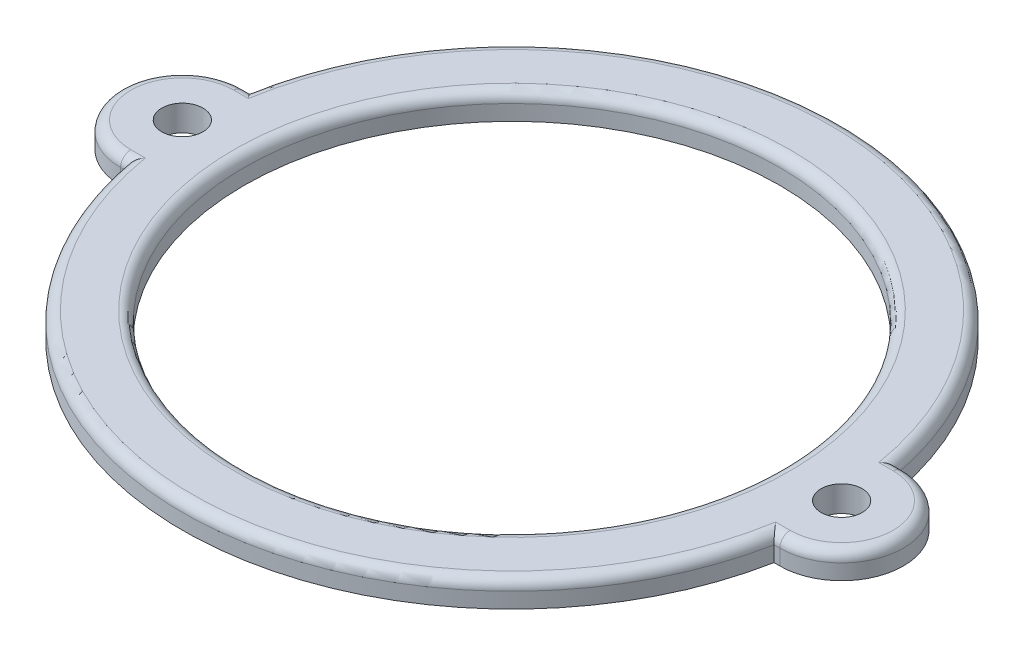
ISO-10303-21;
HEADER;
FILE_DESCRIPTION(('STEP AP214'),'2;1');
FILE_NAME('part.step','',(''),(''),'','','');
FILE_SCHEMA(('AUTOMOTIVE_DESIGN { 1 0 10303 214 1 1 1 1 }'));
ENDSEC;
DATA;
#1=APPLICATION_CONTEXT('core data for automotive mechanical design processes');
#2=APPLICATION_PROTOCOL_DEFINITION('international standard','automotive_design',2000,#1);
#3=PRODUCT_CONTEXT('',#1,'mechanical');
#4=PRODUCT('Part','Part','',(#3));
#5=PRODUCT_RELATED_PRODUCT_CATEGORY('part','',(#4));
#6=PRODUCT_DEFINITION_FORMATION('','',#4);
#7=PRODUCT_DEFINITION_CONTEXT('part definition',#1,'design');
#8=PRODUCT_DEFINITION('design','',#6,#7);
#9=PRODUCT_DEFINITION_SHAPE('','',#8);
#10=(LENGTH_UNIT() NAMED_UNIT(*) SI_UNIT(.MILLI.,.METRE.));
#11=(NAMED_UNIT(*) PLANE_ANGLE_UNIT() SI_UNIT($,.RADIAN.));
#12=(NAMED_UNIT(*) SI_UNIT($,.STERADIAN.) SOLID_ANGLE_UNIT());
#13=UNCERTAINTY_MEASURE_WITH_UNIT(LENGTH_MEASURE(1.E-05),#10,'distance_accuracy_value','');
#14=(GEOMETRIC_REPRESENTATION_CONTEXT(3) GLOBAL_UNCERTAINTY_ASSIGNED_CONTEXT((#13)) GLOBAL_UNIT_ASSIGNED_CONTEXT((#10,
#11,#12)) REPRESENTATION_CONTEXT('',''));
#15=CARTESIAN_POINT('',(0.,0.,0.));
#16=DIRECTION('',(0.,0.,1.));
#17=DIRECTION('',(1.,0.,0.));
#18=AXIS2_PLACEMENT_3D('',#15,#16,#17);
#19=CARTESIAN_POINT('',(32.,2.5,0.));
#20=DIRECTION('',(0.,-1.,0.));
#21=DIRECTION('',(0.,0.,-1.));
#22=AXIS2_PLACEMENT_3D('',#19,#20,#21);
#23=PLANE('',#22);
#24=DIRECTION('',(-1.,0.,0.));
#25=VECTOR('',#24,1.);
#26=CARTESIAN_POINT('',(32.,2.5,-5.00000000000001));
#27=LINE('',#26,#25);
#28=CARTESIAN_POINT('',(32.,2.5,-5.00000000000002));
#29=VERTEX_POINT('',#28);
#30=CARTESIAN_POINT('',(30.5941170815567,2.5,-5.00000000000001));
#31=VERTEX_POINT('',#30);
#32=EDGE_CURVE('E204',#29,#31,#27,.T.);
#33=ORIENTED_EDGE('',*,*,#32,.T.);
#34=CARTESIAN_POINT('',(0.,2.5,0.));
#35=DIRECTION('',(0.,-1.,0.));
#36=DIRECTION('',(0.,0.,-1.));
#37=AXIS2_PLACEMENT_3D('',#34,#35,#36);
#38=CIRCLE('',#37,31.);
#39=CARTESIAN_POINT('',(-30.5941170815567,2.5,-5.));
#40=VERTEX_POINT('',#39);
#41=EDGE_CURVE('E206',#31,#40,#38,.F.);
#42=ORIENTED_EDGE('',*,*,#41,.T.);
#43=DIRECTION('',(-1.,0.,0.));
#44=VECTOR('',#43,1.);
#45=CARTESIAN_POINT('',(32.,2.5,-5.));
#46=LINE('',#45,#44);
#47=CARTESIAN_POINT('',(-32.,2.5,-5.));
#48=VERTEX_POINT('',#47);
#49=EDGE_CURVE('E202',#40,#48,#46,.T.);
#50=ORIENTED_EDGE('',*,*,#49,.T.);
#51=CARTESIAN_POINT('',(-32.,2.5,0.));
#52=DIRECTION('',(0.,-1.,0.));
#53=DIRECTION('',(0.,0.,-1.));
#54=AXIS2_PLACEMENT_3D('',#51,#52,#53);
#55=CIRCLE('',#54,5.);
#56=CARTESIAN_POINT('',(-32.,2.5,5.));
#57=VERTEX_POINT('',#56);
#58=EDGE_CURVE('E198',#48,#57,#55,.F.);
#59=ORIENTED_EDGE('',*,*,#58,.T.);
#60=DIRECTION('',(1.,0.,0.));
#61=VECTOR('',#60,1.);
#62=CARTESIAN_POINT('',(32.,2.5,5.));
#63=LINE('',#62,#61);
#64=CARTESIAN_POINT('',(-30.5941170815567,2.5,5.));
#65=VERTEX_POINT('',#64);
#66=EDGE_CURVE('E193',#57,#65,#63,.T.);
#67=ORIENTED_EDGE('',*,*,#66,.T.);
#68=CARTESIAN_POINT('',(0.,2.5,0.));
#69=DIRECTION('',(0.,-1.,0.));
#70=DIRECTION('',(0.,0.,-1.));
#71=AXIS2_PLACEMENT_3D('',#68,#69,#70);
#72=CIRCLE('',#71,31.);
#73=CARTESIAN_POINT('',(30.5941170815567,2.5,5.00000000000001));
#74=VERTEX_POINT('',#73);
#75=EDGE_CURVE('E191',#65,#74,#72,.F.);
#76=ORIENTED_EDGE('',*,*,#75,.T.);
#77=DIRECTION('',(1.,0.,0.));
#78=VECTOR('',#77,1.);
#79=CARTESIAN_POINT('',(32.,2.5,5.00000000000001));
#80=LINE('',#79,#78);
#81=CARTESIAN_POINT('',(32.,2.5,5.00000000000001));
#82=VERTEX_POINT('',#81);
#83=EDGE_CURVE('E195',#74,#82,#80,.T.);
#84=ORIENTED_EDGE('',*,*,#83,.T.);
#85=CARTESIAN_POINT('',(32.,2.5,0.));
#86=DIRECTION('',(0.,-1.,0.));
#87=DIRECTION('',(0.,0.,-1.));
#88=AXIS2_PLACEMENT_3D('',#85,#86,#87);
#89=CIRCLE('',#88,5.00000000000001);
#90=EDGE_CURVE('E200',#82,#29,#89,.F.);
#91=ORIENTED_EDGE('',*,*,#90,.T.);
#92=EDGE_LOOP('',(#33,#42,#50,#59,#67,#76,#84,#91));
#93=FACE_BOUND('',#92,.T.);
#94=CARTESIAN_POINT('',(0.,2.5,0.));
#95=DIRECTION('',(0.,-1.,0.));
#96=DIRECTION('',(0.,0.,-1.));
#97=AXIS2_PLACEMENT_3D('',#94,#95,#96);
#98=CIRCLE('',#97,27.);
#99=CARTESIAN_POINT('',(0.,2.5,-27.));
#100=VERTEX_POINT('',#99);
#101=EDGE_CURVE('E138',#100,#100,#98,.T.);
#102=ORIENTED_EDGE('',*,*,#101,.T.);
#103=EDGE_LOOP('',(#102));
#104=FACE_BOUND('',#103,.T.);
#105=CARTESIAN_POINT('',(-32.,2.5,0.));
#106=DIRECTION('',(0.,1.,0.));
#107=DIRECTION('',(0.,0.,1.));
#108=AXIS2_PLACEMENT_3D('',#105,#106,#107);
#109=CIRCLE('',#108,2.);
#110=CARTESIAN_POINT('',(-32.,2.5,2.));
#111=VERTEX_POINT('',#110);
#112=EDGE_CURVE('E158',#111,#111,#109,.T.);
#113=ORIENTED_EDGE('',*,*,#112,.F.);
#114=EDGE_LOOP('',(#113));
#115=FACE_BOUND('',#114,.T.);
#116=CARTESIAN_POINT('',(32.,2.5,0.));
#117=DIRECTION('',(0.,1.,0.));
#118=DIRECTION('',(0.,0.,1.));
#119=AXIS2_PLACEMENT_3D('',#116,#117,#118);
#120=CIRCLE('',#119,2.);
#121=CARTESIAN_POINT('',(32.,2.5,1.99999999999999));
#122=VERTEX_POINT('',#121);
#123=EDGE_CURVE('E451',#122,#122,#120,.T.);
#124=ORIENTED_EDGE('',*,*,#123,.F.);
#125=EDGE_LOOP('',(#124));
#126=FACE_BOUND('',#125,.T.);
#127=ADVANCED_FACE('F36',(#93,#104,#115,#126),#23,.F.);
#128=CARTESIAN_POINT('',(32.,0.,0.));
#129=DIRECTION('',(0.,-1.,0.));
#130=DIRECTION('',(0.,0.,-1.));
#131=AXIS2_PLACEMENT_3D('',#128,#129,#130);
#132=PLANE('',#131);
#133=CARTESIAN_POINT('',(-32.,0.,0.));
#134=DIRECTION('',(0.,1.,0.));
#135=DIRECTION('',(0.,0.,1.));
#136=AXIS2_PLACEMENT_3D('',#133,#134,#135);
#137=CIRCLE('',#136,2.);
#138=CARTESIAN_POINT('',(-32.,0.,2.));
#139=VERTEX_POINT('',#138);
#140=EDGE_CURVE('E454',#139,#139,#137,.T.);
#141=ORIENTED_EDGE('',*,*,#140,.T.);
#142=EDGE_LOOP('',(#141));
#143=FACE_BOUND('',#142,.T.);
#144=CARTESIAN_POINT('',(32.,0.,0.));
#145=DIRECTION('',(0.,1.,0.));
#146=DIRECTION('',(0.,0.,-1.));
#147=AXIS2_PLACEMENT_3D('',#144,#145,#146);
#148=CIRCLE('',#147,6.00000000000001);
#149=CARTESIAN_POINT('',(32.,0.,6.00000000000001));
#150=VERTEX_POINT('',#149);
#151=CARTESIAN_POINT('',(32.,0.,-6.00000000000001));
#152=VERTEX_POINT('',#151);
#153=EDGE_CURVE('E146',#150,#152,#148,.T.);
#154=ORIENTED_EDGE('',*,*,#153,.F.);
#155=DIRECTION('',(1.,0.,0.));
#156=VECTOR('',#155,1.);
#157=CARTESIAN_POINT('',(32.,0.,6.00000000000001));
#158=LINE('',#157,#156);
#159=CARTESIAN_POINT('',(31.4324672910034,0.,6.));
#160=VERTEX_POINT('',#159);
#161=EDGE_CURVE('E175',#160,#150,#158,.T.);
#162=ORIENTED_EDGE('',*,*,#161,.F.);
#163=CARTESIAN_POINT('',(0.,0.,0.));
#164=DIRECTION('',(0.,1.,0.));
#165=DIRECTION('',(0.,0.,1.));
#166=AXIS2_PLACEMENT_3D('',#163,#164,#165);
#167=CIRCLE('',#166,32.);
#168=CARTESIAN_POINT('',(-31.4324672910034,0.,6.));
#169=VERTEX_POINT('',#168);
#170=EDGE_CURVE('E172',#169,#160,#167,.T.);
#171=ORIENTED_EDGE('',*,*,#170,.F.);
#172=DIRECTION('',(1.,0.,0.));
#173=VECTOR('',#172,1.);
#174=CARTESIAN_POINT('',(-32.,0.,6.));
#175=LINE('',#174,#173);
#176=CARTESIAN_POINT('',(-32.,0.,6.));
#177=VERTEX_POINT('',#176);
#178=EDGE_CURVE('E169',#177,#169,#175,.T.);
#179=ORIENTED_EDGE('',*,*,#178,.F.);
#180=CARTESIAN_POINT('',(-32.,0.,0.));
#181=DIRECTION('',(0.,1.,0.));
#182=DIRECTION('',(0.,0.,1.));
#183=AXIS2_PLACEMENT_3D('',#180,#181,#182);
#184=CIRCLE('',#183,6.);
#185=CARTESIAN_POINT('',(-32.,0.,-6.));
#186=VERTEX_POINT('',#185);
#187=EDGE_CURVE('E166',#186,#177,#184,.T.);
#188=ORIENTED_EDGE('',*,*,#187,.F.);
#189=DIRECTION('',(-1.,0.,0.));
#190=VECTOR('',#189,1.);
#191=CARTESIAN_POINT('',(-32.,0.,-6.));
#192=LINE('',#191,#190);
#193=CARTESIAN_POINT('',(-31.4324672910034,0.,-6.00000000000001));
#194=VERTEX_POINT('',#193);
#195=EDGE_CURVE('E163',#194,#186,#192,.T.);
#196=ORIENTED_EDGE('',*,*,#195,.F.);
#197=CARTESIAN_POINT('',(0.,0.,0.));
#198=DIRECTION('',(0.,1.,0.));
#199=DIRECTION('',(0.,0.,1.));
#200=AXIS2_PLACEMENT_3D('',#197,#198,#199);
#201=CIRCLE('',#200,32.);
#202=CARTESIAN_POINT('',(31.4324672910034,0.,-6.00000000000001));
#203=VERTEX_POINT('',#202);
#204=EDGE_CURVE('E149',#203,#194,#201,.T.);
#205=ORIENTED_EDGE('',*,*,#204,.F.);
#206=DIRECTION('',(-1.,0.,0.));
#207=VECTOR('',#206,1.);
#208=CARTESIAN_POINT('',(32.,0.,-6.00000000000001));
#209=LINE('',#208,#207);
#210=EDGE_CURVE('E131',#152,#203,#209,.T.);
#211=ORIENTED_EDGE('',*,*,#210,.F.);
#212=EDGE_LOOP('',(#154,#162,#171,#179,#188,#196,#205,#211));
#213=FACE_BOUND('',#212,.T.);
#214=CARTESIAN_POINT('',(0.,0.,0.));
#215=DIRECTION('',(0.,1.,0.));
#216=DIRECTION('',(0.,0.,1.));
#217=AXIS2_PLACEMENT_3D('',#214,#215,#216);
#218=CIRCLE('',#217,26.);
#219=CARTESIAN_POINT('',(0.,0.,26.));
#220=VERTEX_POINT('',#219);
#221=EDGE_CURVE('E155',#220,#220,#218,.T.);
#222=ORIENTED_EDGE('',*,*,#221,.T.);
#223=EDGE_LOOP('',(#222));
#224=FACE_BOUND('',#223,.T.);
#225=CARTESIAN_POINT('',(32.,0.,0.));
#226=DIRECTION('',(0.,1.,0.));
#227=DIRECTION('',(0.,0.,1.));
#228=AXIS2_PLACEMENT_3D('',#225,#226,#227);
#229=CIRCLE('',#228,2.);
#230=CARTESIAN_POINT('',(32.,0.,1.99999999999999));
#231=VERTEX_POINT('',#230);
#232=EDGE_CURVE('E449',#231,#231,#229,.T.);
#233=ORIENTED_EDGE('',*,*,#232,.T.);
#234=EDGE_LOOP('',(#233));
#235=FACE_BOUND('',#234,.T.);
#236=ADVANCED_FACE('F143',(#143,#213,#224,#235),#132,.T.);
#237=CARTESIAN_POINT('',(32.,2.5,0.));
#238=DIRECTION('',(0.,-1.,0.));
#239=DIRECTION('',(0.,0.,-1.));
#240=AXIS2_PLACEMENT_3D('',#237,#238,#239);
#241=CYLINDRICAL_SURFACE('',#240,6.00000000000001);
#242=DIRECTION('',(0.,-1.,0.));
#243=VECTOR('',#242,1.);
#244=CARTESIAN_POINT('',(32.,2.5,-6.00000000000001));
#245=LINE('',#244,#243);
#246=CARTESIAN_POINT('',(32.,1.5,-6.00000000000001));
#247=VERTEX_POINT('',#246);
#248=EDGE_CURVE('E127',#247,#152,#245,.T.);
#249=ORIENTED_EDGE('',*,*,#248,.F.);
#250=CARTESIAN_POINT('',(32.,1.5,0.));
#251=DIRECTION('',(0.,-1.,0.));
#252=DIRECTION('',(0.,0.,-1.));
#253=AXIS2_PLACEMENT_3D('',#250,#251,#252);
#254=CIRCLE('',#253,6.00000000000001);
#255=CARTESIAN_POINT('',(32.,1.5,6.00000000000001));
#256=VERTEX_POINT('',#255);
#257=EDGE_CURVE('E215',#247,#256,#254,.T.);
#258=ORIENTED_EDGE('',*,*,#257,.T.);
#259=DIRECTION('',(0.,-1.,0.));
#260=VECTOR('',#259,1.);
#261=CARTESIAN_POINT('',(32.,2.5,6.00000000000001));
#262=LINE('',#261,#260);
#263=EDGE_CURVE('E153',#256,#150,#262,.T.);
#264=ORIENTED_EDGE('',*,*,#263,.T.);
#265=ORIENTED_EDGE('',*,*,#153,.T.);
#266=EDGE_LOOP('',(#249,#258,#264,#265));
#267=FACE_BOUND('',#266,.T.);
#268=ADVANCED_FACE('F151',(#267),#241,.T.);
#269=CARTESIAN_POINT('',(32.,2.5,-6.00000000000001));
#270=DIRECTION('',(0.,0.,1.));
#271=DIRECTION('',(1.,0.,0.));
#272=AXIS2_PLACEMENT_3D('',#269,#270,#271);
#273=PLANE('',#272);
#274=DIRECTION('',(0.,-1.,0.));
#275=VECTOR('',#274,1.);
#276=CARTESIAN_POINT('',(31.4324672910034,2.5,-6.00000000000001));
#277=LINE('',#276,#275);
#278=CARTESIAN_POINT('',(31.4324672910034,1.5,-6.00000000000001));
#279=VERTEX_POINT('',#278);
#280=EDGE_CURVE('E139',#279,#203,#277,.T.);
#281=ORIENTED_EDGE('',*,*,#280,.F.);
#282=DIRECTION('',(-1.,0.,0.));
#283=VECTOR('',#282,1.);
#284=CARTESIAN_POINT('',(32.,1.5,-6.00000000000001));
#285=LINE('',#284,#283);
#286=EDGE_CURVE('E134',#279,#247,#285,.F.);
#287=ORIENTED_EDGE('',*,*,#286,.T.);
#288=ORIENTED_EDGE('',*,*,#248,.T.);
#289=ORIENTED_EDGE('',*,*,#210,.T.);
#290=EDGE_LOOP('',(#281,#287,#288,#289));
#291=FACE_BOUND('',#290,.T.);
#292=ADVANCED_FACE('F130',(#291),#273,.F.);
#293=CARTESIAN_POINT('',(0.,2.5,0.));
#294=DIRECTION('',(0.,-1.,0.));
#295=DIRECTION('',(0.,0.,-1.));
#296=AXIS2_PLACEMENT_3D('',#293,#294,#295);
#297=CYLINDRICAL_SURFACE('',#296,32.);
#298=DIRECTION('',(0.,-1.,0.));
#299=VECTOR('',#298,1.);
#300=CARTESIAN_POINT('',(-31.4324672910034,2.5,-6.00000000000001));
#301=LINE('',#300,#299);
#302=CARTESIAN_POINT('',(-31.4324672910034,1.5,-6.00000000000001));
#303=VERTEX_POINT('',#302);
#304=EDGE_CURVE('E186',#303,#194,#301,.T.);
#305=ORIENTED_EDGE('',*,*,#304,.F.);
#306=CARTESIAN_POINT('',(0.,1.5,0.));
#307=DIRECTION('',(0.,-1.,0.));
#308=DIRECTION('',(0.,0.,-1.));
#309=AXIS2_PLACEMENT_3D('',#306,#307,#308);
#310=CIRCLE('',#309,32.);
#311=EDGE_CURVE('E219',#303,#279,#310,.T.);
#312=ORIENTED_EDGE('',*,*,#311,.T.);
#313=ORIENTED_EDGE('',*,*,#280,.T.);
#314=ORIENTED_EDGE('',*,*,#204,.T.);
#315=EDGE_LOOP('',(#305,#312,#313,#314));
#316=FACE_BOUND('',#315,.T.);
#317=ADVANCED_FACE('F320',(#316),#297,.T.);
#318=CARTESIAN_POINT('',(-32.,2.5,-6.));
#319=DIRECTION('',(0.,0.,1.));
#320=DIRECTION('',(1.,0.,0.));
#321=AXIS2_PLACEMENT_3D('',#318,#319,#320);
#322=PLANE('',#321);
#323=DIRECTION('',(0.,-1.,0.));
#324=VECTOR('',#323,1.);
#325=CARTESIAN_POINT('',(-32.,2.5,-6.));
#326=LINE('',#325,#324);
#327=CARTESIAN_POINT('',(-32.,1.5,-6.));
#328=VERTEX_POINT('',#327);
#329=EDGE_CURVE('E184',#328,#186,#326,.T.);
#330=ORIENTED_EDGE('',*,*,#329,.F.);
#331=DIRECTION('',(-1.,0.,0.));
#332=VECTOR('',#331,1.);
#333=CARTESIAN_POINT('',(-32.,1.5,-6.));
#334=LINE('',#333,#332);
#335=EDGE_CURVE('E212',#328,#303,#334,.F.);
#336=ORIENTED_EDGE('',*,*,#335,.T.);
#337=ORIENTED_EDGE('',*,*,#304,.T.);
#338=ORIENTED_EDGE('',*,*,#195,.T.);
#339=EDGE_LOOP('',(#330,#336,#337,#338));
#340=FACE_BOUND('',#339,.T.);
#341=ADVANCED_FACE('F316',(#340),#322,.F.);
#342=CARTESIAN_POINT('',(-32.,2.5,0.));
#343=DIRECTION('',(0.,-1.,0.));
#344=DIRECTION('',(0.,0.,-1.));
#345=AXIS2_PLACEMENT_3D('',#342,#343,#344);
#346=CYLINDRICAL_SURFACE('',#345,6.);
#347=DIRECTION('',(0.,-1.,0.));
#348=VECTOR('',#347,1.);
#349=CARTESIAN_POINT('',(-32.,2.5,6.));
#350=LINE('',#349,#348);
#351=CARTESIAN_POINT('',(-32.,1.5,6.));
#352=VERTEX_POINT('',#351);
#353=EDGE_CURVE('E182',#352,#177,#350,.T.);
#354=ORIENTED_EDGE('',*,*,#353,.F.);
#355=CARTESIAN_POINT('',(-32.,1.5,0.));
#356=DIRECTION('',(0.,-1.,0.));
#357=DIRECTION('',(0.,0.,-1.));
#358=AXIS2_PLACEMENT_3D('',#355,#356,#357);
#359=CIRCLE('',#358,6.);
#360=EDGE_CURVE('E217',#352,#328,#359,.T.);
#361=ORIENTED_EDGE('',*,*,#360,.T.);
#362=ORIENTED_EDGE('',*,*,#329,.T.);
#363=ORIENTED_EDGE('',*,*,#187,.T.);
#364=EDGE_LOOP('',(#354,#361,#362,#363));
#365=FACE_BOUND('',#364,.T.);
#366=ADVANCED_FACE('F313',(#365),#346,.T.);
#367=CARTESIAN_POINT('',(-32.,2.5,6.));
#368=DIRECTION('',(0.,0.,-1.));
#369=DIRECTION('',(-1.,0.,0.));
#370=AXIS2_PLACEMENT_3D('',#367,#368,#369);
#371=PLANE('',#370);
#372=DIRECTION('',(0.,-1.,0.));
#373=VECTOR('',#372,1.);
#374=CARTESIAN_POINT('',(-31.4324672910034,2.5,6.));
#375=LINE('',#374,#373);
#376=CARTESIAN_POINT('',(-31.4324672910034,1.5,6.));
#377=VERTEX_POINT('',#376);
#378=EDGE_CURVE('E180',#377,#169,#375,.T.);
#379=ORIENTED_EDGE('',*,*,#378,.F.);
#380=DIRECTION('',(1.,0.,0.));
#381=VECTOR('',#380,1.);
#382=CARTESIAN_POINT('',(-32.,1.5,6.));
#383=LINE('',#382,#381);
#384=EDGE_CURVE('E53',#377,#352,#383,.F.);
#385=ORIENTED_EDGE('',*,*,#384,.T.);
#386=ORIENTED_EDGE('',*,*,#353,.T.);
#387=ORIENTED_EDGE('',*,*,#178,.T.);
#388=EDGE_LOOP('',(#379,#385,#386,#387));
#389=FACE_BOUND('',#388,.T.);
#390=ADVANCED_FACE('F310',(#389),#371,.F.);
#391=CARTESIAN_POINT('',(0.,2.5,0.));
#392=DIRECTION('',(0.,-1.,0.));
#393=DIRECTION('',(0.,0.,-1.));
#394=AXIS2_PLACEMENT_3D('',#391,#392,#393);
#395=CYLINDRICAL_SURFACE('',#394,32.);
#396=DIRECTION('',(0.,-1.,0.));
#397=VECTOR('',#396,1.);
#398=CARTESIAN_POINT('',(31.4324672910034,2.5,6.));
#399=LINE('',#398,#397);
#400=CARTESIAN_POINT('',(31.4324672910034,1.5,6.));
#401=VERTEX_POINT('',#400);
#402=EDGE_CURVE('E178',#401,#160,#399,.T.);
#403=ORIENTED_EDGE('',*,*,#402,.F.);
#404=CARTESIAN_POINT('',(0.,1.5,0.));
#405=DIRECTION('',(0.,-1.,0.));
#406=DIRECTION('',(0.,0.,-1.));
#407=AXIS2_PLACEMENT_3D('',#404,#405,#406);
#408=CIRCLE('',#407,32.);
#409=EDGE_CURVE('E45',#401,#377,#408,.T.);
#410=ORIENTED_EDGE('',*,*,#409,.T.);
#411=ORIENTED_EDGE('',*,*,#378,.T.);
#412=ORIENTED_EDGE('',*,*,#170,.T.);
#413=EDGE_LOOP('',(#403,#410,#411,#412));
#414=FACE_BOUND('',#413,.T.);
#415=ADVANCED_FACE('F306',(#414),#395,.T.);
#416=CARTESIAN_POINT('',(32.,2.5,6.00000000000001));
#417=DIRECTION('',(0.,0.,-1.));
#418=DIRECTION('',(-1.,0.,0.));
#419=AXIS2_PLACEMENT_3D('',#416,#417,#418);
#420=PLANE('',#419);
#421=ORIENTED_EDGE('',*,*,#263,.F.);
#422=DIRECTION('',(1.,0.,0.));
#423=VECTOR('',#422,1.);
#424=CARTESIAN_POINT('',(32.,1.5,6.00000000000001));
#425=LINE('',#424,#423);
#426=EDGE_CURVE('E208',#256,#401,#425,.F.);
#427=ORIENTED_EDGE('',*,*,#426,.T.);
#428=ORIENTED_EDGE('',*,*,#402,.T.);
#429=ORIENTED_EDGE('',*,*,#161,.T.);
#430=EDGE_LOOP('',(#421,#427,#428,#429));
#431=FACE_BOUND('',#430,.T.);
#432=ADVANCED_FACE('F303',(#431),#420,.F.);
#433=CARTESIAN_POINT('',(0.,2.5,0.));
#434=DIRECTION('',(0.,-1.,0.));
#435=DIRECTION('',(0.,0.,-1.));
#436=AXIS2_PLACEMENT_3D('',#433,#434,#435);
#437=CYLINDRICAL_SURFACE('',#436,26.);
#438=CARTESIAN_POINT('',(0.,1.5,0.));
#439=DIRECTION('',(0.,-1.,0.));
#440=DIRECTION('',(0.,0.,-1.));
#441=AXIS2_PLACEMENT_3D('',#438,#439,#440);
#442=CIRCLE('',#441,26.);
#443=CARTESIAN_POINT('',(0.,1.5,-26.));
#444=VERTEX_POINT('',#443);
#445=EDGE_CURVE('E11',#444,#444,#442,.F.);
#446=ORIENTED_EDGE('',*,*,#445,.T.);
#447=EDGE_LOOP('',(#446));
#448=FACE_BOUND('',#447,.T.);
#449=ORIENTED_EDGE('',*,*,#221,.F.);
#450=EDGE_LOOP('',(#449));
#451=FACE_BOUND('',#450,.T.);
#452=ADVANCED_FACE('F300',(#448,#451),#437,.F.);
#453=CARTESIAN_POINT('',(-32.,2.5,0.));
#454=DIRECTION('',(0.,-1.,0.));
#455=DIRECTION('',(0.,0.,-1.));
#456=AXIS2_PLACEMENT_3D('',#453,#454,#455);
#457=CYLINDRICAL_SURFACE('',#456,2.);
#458=ORIENTED_EDGE('',*,*,#112,.T.);
#459=EDGE_LOOP('',(#458));
#460=FACE_BOUND('',#459,.T.);
#461=ORIENTED_EDGE('',*,*,#140,.F.);
#462=EDGE_LOOP('',(#461));
#463=FACE_BOUND('',#462,.T.);
#464=ADVANCED_FACE('F365',(#460,#463),#457,.F.);
#465=CARTESIAN_POINT('',(32.,2.5,0.));
#466=DIRECTION('',(0.,-1.,0.));
#467=DIRECTION('',(0.,0.,-1.));
#468=AXIS2_PLACEMENT_3D('',#465,#466,#467);
#469=CYLINDRICAL_SURFACE('',#468,2.);
#470=ORIENTED_EDGE('',*,*,#123,.T.);
#471=EDGE_LOOP('',(#470));
#472=FACE_BOUND('',#471,.T.);
#473=ORIENTED_EDGE('',*,*,#232,.F.);
#474=EDGE_LOOP('',(#473));
#475=FACE_BOUND('',#474,.T.);
#476=ADVANCED_FACE('F283',(#472,#475),#469,.F.);
#477=CARTESIAN_POINT('',(32.,1.5,-5.));
#478=DIRECTION('',(-1.,0.,0.));
#479=DIRECTION('',(0.,0.,1.));
#480=AXIS2_PLACEMENT_3D('',#477,#478,#479);
#481=CYLINDRICAL_SURFACE('',#480,1.);
#482=CARTESIAN_POINT('',(-31.4324672910034,1.5,-6.));
#483=CARTESIAN_POINT('',(-31.4324692639046,1.52358201041163,-6.00000247607138));
#484=CARTESIAN_POINT('',(-31.4317767256196,1.54715058152679,-5.99916513892679));
#485=CARTESIAN_POINT('',(-31.4290279853469,1.59407796115698,-5.99584225442497));
#486=CARTESIAN_POINT('',(-31.4269725632437,1.61743688189703,-5.99335764968567));
#487=CARTESIAN_POINT('',(-31.4188403435729,1.68661196276537,-5.98352880521257));
#488=CARTESIAN_POINT('',(-31.4107967059106,1.73189129060696,-5.97380844159797));
#489=CARTESIAN_POINT('',(-31.3899821244825,1.81953800593398,-5.9486706131637));
#490=CARTESIAN_POINT('',(-31.3772200957948,1.86191070743624,-5.93326389242225));
#491=CARTESIAN_POINT('',(-31.3476355124716,1.94308593357905,-5.897577559808));
#492=CARTESIAN_POINT('',(-31.330805948231,1.98188213362624,-5.87728953623582));
#493=CARTESIAN_POINT('',(-31.2878710520249,2.06712505810696,-5.82558234942473));
#494=CARTESIAN_POINT('',(-31.2605210691512,2.11204438126115,-5.79267902171707));
#495=CARTESIAN_POINT('',(-31.2014574695268,2.19430886439769,-5.72173216048847));
#496=CARTESIAN_POINT('',(-31.1697368554153,2.23164163625714,-5.68368038612542));
#497=CARTESIAN_POINT('',(-31.0936371307115,2.30831393891012,-5.59254705316981));
#498=CARTESIAN_POINT('',(-31.048224555722,2.34520122960949,-5.53826993663993));
#499=CARTESIAN_POINT('',(-30.9540536615659,2.40700098437203,-5.42598491054516));
#500=CARTESIAN_POINT('',(-30.9052927158832,2.43190392222234,-5.36797407447976));
#501=CARTESIAN_POINT('',(-30.8135885620467,2.46725818707125,-5.25914369719516));
#502=CARTESIAN_POINT('',(-30.7709213835234,2.47935575233122,-5.20861052524154));
#503=CARTESIAN_POINT('',(-30.6849218695679,2.49558909746566,-5.10697283946081));
#504=CARTESIAN_POINT('',(-30.6415910346005,2.49974074761948,-5.05586966997111));
#505=CARTESIAN_POINT('',(-30.5968654637998,2.4999960771409,-5.00323412092456));
#506=CARTESIAN_POINT('',(-30.5954912773824,2.49999999914842,-5.00161701116336));
#507=CARTESIAN_POINT('',(-30.5941170815567,2.5,-5.));
#508=B_SPLINE_CURVE_WITH_KNOTS('',3,(#482,#483,#484,#485,#486,#487,#488,#489,#490,#491,#492,
#493,#494,#495,#496,#497,#498,#499,#500,#501,#502,#503,#504,#505,#506,#507),.UNSPECIFIED.,.F.,
.F.,(4,2,2,2,2,2,2,2,2,2,2,2,4),(0.,0.070695278580137,0.141350137991297,0.281581448183231,
0.421549143755342,0.561759788149986,0.74686099470962,0.932262067437008,1.17042361424716,
1.40877416128679,1.61001951858574,1.81086250981159,1.81722889076569),.UNSPECIFIED.);
#509=EDGE_CURVE('E273',#303,#40,#508,.T.);
#510=ORIENTED_EDGE('',*,*,#509,.F.);
#511=ORIENTED_EDGE('',*,*,#335,.F.);
#512=CARTESIAN_POINT('',(-32.,1.5,-5.));
#513=DIRECTION('',(-1.,0.,0.));
#514=DIRECTION('',(0.,0.,1.));
#515=AXIS2_PLACEMENT_3D('',#512,#513,#514);
#516=CIRCLE('',#515,1.);
#517=EDGE_CURVE('E40',#48,#328,#516,.T.);
#518=ORIENTED_EDGE('',*,*,#517,.F.);
#519=ORIENTED_EDGE('',*,*,#49,.F.);
#520=EDGE_LOOP('',(#510,#511,#518,#519));
#521=FACE_BOUND('',#520,.T.);
#522=ADVANCED_FACE('F280',(#521),#481,.T.);
#523=CARTESIAN_POINT('',(-32.,1.5,0.));
#524=DIRECTION('',(0.,-1.,0.));
#525=DIRECTION('',(0.,0.,-1.));
#526=AXIS2_PLACEMENT_3D('',#523,#524,#525);
#527=TOROIDAL_SURFACE('',#526,5.,1.);
#528=ORIENTED_EDGE('',*,*,#517,.T.);
#529=ORIENTED_EDGE('',*,*,#360,.F.);
#530=CARTESIAN_POINT('',(-32.,1.5,5.));
#531=DIRECTION('',(1.,0.,0.));
#532=DIRECTION('',(0.,0.,-1.));
#533=AXIS2_PLACEMENT_3D('',#530,#531,#532);
#534=CIRCLE('',#533,1.);
#535=EDGE_CURVE('E279',#57,#352,#534,.T.);
#536=ORIENTED_EDGE('',*,*,#535,.F.);
#537=ORIENTED_EDGE('',*,*,#58,.F.);
#538=EDGE_LOOP('',(#528,#529,#536,#537));
#539=FACE_BOUND('',#538,.T.);
#540=ADVANCED_FACE('F268',(#539),#527,.T.);
#541=CARTESIAN_POINT('',(0.,1.5,0.));
#542=DIRECTION('',(0.,-1.,0.));
#543=DIRECTION('',(0.,0.,-1.));
#544=AXIS2_PLACEMENT_3D('',#541,#542,#543);
#545=TOROIDAL_SURFACE('',#544,31.,1.);
#546=ORIENTED_EDGE('',*,*,#509,.T.);
#547=ORIENTED_EDGE('',*,*,#41,.F.);
#548=CARTESIAN_POINT('',(31.4324672910034,1.5,-6.00000000000001));
#549=CARTESIAN_POINT('',(31.4324692639046,1.52358201041163,-6.00000247607139));
#550=CARTESIAN_POINT('',(31.4317767256196,1.54715058152679,-5.9991651389268));
#551=CARTESIAN_POINT('',(31.4290279853469,1.59407796115697,-5.99584225442498));
#552=CARTESIAN_POINT('',(31.4269725632437,1.61743688189703,-5.99335764968568));
#553=CARTESIAN_POINT('',(31.4188403435729,1.68661196276537,-5.98352880521257));
#554=CARTESIAN_POINT('',(31.4107967059106,1.73189129060696,-5.97380844159798));
#555=CARTESIAN_POINT('',(31.3899821244825,1.81953800593398,-5.94867061316371));
#556=CARTESIAN_POINT('',(31.3772200957948,1.86191070743624,-5.93326389242226));
#557=CARTESIAN_POINT('',(31.3476355124716,1.94308593357905,-5.89757755980801));
#558=CARTESIAN_POINT('',(31.330805948231,1.98188213362624,-5.87728953623583));
#559=CARTESIAN_POINT('',(31.2878710520249,2.06712505810697,-5.82558234942473));
#560=CARTESIAN_POINT('',(31.2605210691512,2.11204438126115,-5.79267902171707));
#561=CARTESIAN_POINT('',(31.2014574695268,2.19430886439769,-5.72173216048848));
#562=CARTESIAN_POINT('',(31.1697368554153,2.23164163625714,-5.68368038612543));
#563=CARTESIAN_POINT('',(31.0936371307115,2.30831393891012,-5.59254705316982));
#564=CARTESIAN_POINT('',(31.048224555722,2.34520122960949,-5.53826993663993));
#565=CARTESIAN_POINT('',(30.9540536615659,2.40700098437203,-5.42598491054517));
#566=CARTESIAN_POINT('',(30.9052927158832,2.43190392222234,-5.36797407447978));
#567=CARTESIAN_POINT('',(30.8135885620467,2.46725818707125,-5.25914369719515));
#568=CARTESIAN_POINT('',(30.7709213835235,2.47935575233122,-5.20861052524149));
#569=CARTESIAN_POINT('',(30.6849218695678,2.49558909746566,-5.10697283946088));
#570=CARTESIAN_POINT('',(30.6415910346002,2.49974074761948,-5.05586966997134));
#571=CARTESIAN_POINT('',(30.5968654637998,2.4999960771409,-5.00323412092458));
#572=CARTESIAN_POINT('',(30.5954912773824,2.49999999914842,-5.00161701116337));
#573=CARTESIAN_POINT('',(30.5941170815567,2.5,-5.00000000000001));
#574=B_SPLINE_CURVE_WITH_KNOTS('',3,(#548,#549,#550,#551,#552,#553,#554,#555,#556,#557,#558,
#559,#560,#561,#562,#563,#564,#565,#566,#567,#568,#569,#570,#571,#572,#573),.UNSPECIFIED.,.F.,
.F.,(4,2,2,2,2,2,2,2,2,2,2,2,4),(0.,0.0706952785801361,0.141350137991297,0.281581448183231,
0.421549143755344,0.561759788149988,0.746860994709623,0.932262067437009,1.17042361424717,
1.40877416128679,1.61001951858574,1.8108625098116,1.81722889076569),.UNSPECIFIED.);
#575=EDGE_CURVE('E253',#279,#31,#574,.T.);
#576=ORIENTED_EDGE('',*,*,#575,.F.);
#577=ORIENTED_EDGE('',*,*,#311,.F.);
#578=EDGE_LOOP('',(#546,#547,#576,#577));
#579=FACE_BOUND('',#578,.T.);
#580=ADVANCED_FACE('F264',(#579),#545,.T.);
#581=CARTESIAN_POINT('',(32.,1.5,5.));
#582=DIRECTION('',(1.,0.,0.));
#583=DIRECTION('',(0.,0.,-1.));
#584=AXIS2_PLACEMENT_3D('',#581,#582,#583);
#585=CYLINDRICAL_SURFACE('',#584,1.);
#586=ORIENTED_EDGE('',*,*,#535,.T.);
#587=ORIENTED_EDGE('',*,*,#384,.F.);
#588=CARTESIAN_POINT('',(-31.4324672910034,1.5,6.));
#589=CARTESIAN_POINT('',(-31.4324692639046,1.52358201041163,6.00000247607138));
#590=CARTESIAN_POINT('',(-31.4317767256196,1.54715058152679,5.99916513892679));
#591=CARTESIAN_POINT('',(-31.4290279853469,1.59407796115698,5.99584225442497));
#592=CARTESIAN_POINT('',(-31.4269725632437,1.61743688189703,5.99335764968568));
#593=CARTESIAN_POINT('',(-31.4188403435729,1.68661196276537,5.98352880521257));
#594=CARTESIAN_POINT('',(-31.4107967059106,1.73189129060696,5.97380844159797));
#595=CARTESIAN_POINT('',(-31.3899821244825,1.81953800593398,5.9486706131637));
#596=CARTESIAN_POINT('',(-31.3772200957948,1.86191070743624,5.93326389242225));
#597=CARTESIAN_POINT('',(-31.3476355124716,1.94308593357905,5.897577559808));
#598=CARTESIAN_POINT('',(-31.330805948231,1.98188213362624,5.87728953623582));
#599=CARTESIAN_POINT('',(-31.2878710520249,2.06712505810696,5.82558234942473));
#600=CARTESIAN_POINT('',(-31.2605210691512,2.11204438126115,5.79267902171707));
#601=CARTESIAN_POINT('',(-31.2014574695268,2.19430886439769,5.72173216048847));
#602=CARTESIAN_POINT('',(-31.1697368554153,2.23164163625714,5.68368038612542));
#603=CARTESIAN_POINT('',(-31.0936371307115,2.30831393891012,5.59254705316981));
#604=CARTESIAN_POINT('',(-31.048224555722,2.34520122960949,5.53826993663993));
#605=CARTESIAN_POINT('',(-30.9540536615659,2.40700098437203,5.42598491054516));
#606=CARTESIAN_POINT('',(-30.9052927158832,2.43190392222234,5.36797407447976));
#607=CARTESIAN_POINT('',(-30.8135885620467,2.46725818707125,5.25914369719516));
#608=CARTESIAN_POINT('',(-30.7709213835234,2.47935575233122,5.20861052524154));
#609=CARTESIAN_POINT('',(-30.6849218695679,2.49558909746566,5.10697283946081));
#610=CARTESIAN_POINT('',(-30.6415910346005,2.49974074761948,5.05586966997111));
#611=CARTESIAN_POINT('',(-30.5968654637998,2.4999960771409,5.00323412092456));
#612=CARTESIAN_POINT('',(-30.5954912773824,2.49999999914842,5.00161701116336));
#613=CARTESIAN_POINT('',(-30.5941170815567,2.5,5.));
#614=B_SPLINE_CURVE_WITH_KNOTS('',3,(#588,#589,#590,#591,#592,#593,#594,#595,#596,#597,#598,
#599,#600,#601,#602,#603,#604,#605,#606,#607,#608,#609,#610,#611,#612,#613),.UNSPECIFIED.,.F.,
.F.,(4,2,2,2,2,2,2,2,2,2,2,2,4),(0.,0.0706952785801368,0.141350137991297,0.281581448183231,
0.421549143755342,0.561759788149986,0.746860994709621,0.932262067437008,1.17042361424716,
1.40877416128679,1.61001951858574,1.81086250981159,1.81722889076569),.UNSPECIFIED.);
#615=EDGE_CURVE('E246',#65,#377,#614,.F.);
#616=ORIENTED_EDGE('',*,*,#615,.F.);
#617=ORIENTED_EDGE('',*,*,#66,.F.);
#618=EDGE_LOOP('',(#586,#587,#616,#617));
#619=FACE_BOUND('',#618,.T.);
#620=ADVANCED_FACE('F261',(#619),#585,.T.);
#621=CARTESIAN_POINT('',(32.,1.5,-5.00000000000001));
#622=DIRECTION('',(-1.,0.,0.));
#623=DIRECTION('',(0.,0.,1.));
#624=AXIS2_PLACEMENT_3D('',#621,#622,#623);
#625=CYLINDRICAL_SURFACE('',#624,1.);
#626=ORIENTED_EDGE('',*,*,#575,.T.);
#627=ORIENTED_EDGE('',*,*,#32,.F.);
#628=CARTESIAN_POINT('',(32.,1.5,-5.00000000000001));
#629=DIRECTION('',(1.,0.,0.));
#630=DIRECTION('',(0.,0.,-1.));
#631=AXIS2_PLACEMENT_3D('',#628,#629,#630);
#632=CIRCLE('',#631,1.);
#633=EDGE_CURVE('E232',#247,#29,#632,.T.);
#634=ORIENTED_EDGE('',*,*,#633,.F.);
#635=ORIENTED_EDGE('',*,*,#286,.F.);
#636=EDGE_LOOP('',(#626,#627,#634,#635));
#637=FACE_BOUND('',#636,.T.);
#638=ADVANCED_FACE('F242',(#637),#625,.T.);
#639=CARTESIAN_POINT('',(0.,1.5,0.));
#640=DIRECTION('',(0.,-1.,0.));
#641=DIRECTION('',(0.,0.,-1.));
#642=AXIS2_PLACEMENT_3D('',#639,#640,#641);
#643=TOROIDAL_SURFACE('',#642,31.,1.);
#644=ORIENTED_EDGE('',*,*,#615,.T.);
#645=ORIENTED_EDGE('',*,*,#409,.F.);
#646=CARTESIAN_POINT('',(31.4324672910034,1.5,6.00000000000001));
#647=CARTESIAN_POINT('',(31.4324692639046,1.52358201041163,6.00000247607139));
#648=CARTESIAN_POINT('',(31.4317767256196,1.54715058152679,5.9991651389268));
#649=CARTESIAN_POINT('',(31.4290279853469,1.59407796115697,5.99584225442498));
#650=CARTESIAN_POINT('',(31.4269725632437,1.61743688189703,5.99335764968568));
#651=CARTESIAN_POINT('',(31.4188403435729,1.68661196276537,5.98352880521257));
#652=CARTESIAN_POINT('',(31.4107967059106,1.73189129060696,5.97380844159798));
#653=CARTESIAN_POINT('',(31.3899821244825,1.81953800593398,5.94867061316371));
#654=CARTESIAN_POINT('',(31.3772200957948,1.86191070743624,5.93326389242226));
#655=CARTESIAN_POINT('',(31.3476355124716,1.94308593357905,5.89757755980801));
#656=CARTESIAN_POINT('',(31.330805948231,1.98188213362624,5.87728953623583));
#657=CARTESIAN_POINT('',(31.2878710520249,2.06712505810697,5.82558234942473));
#658=CARTESIAN_POINT('',(31.2605210691512,2.11204438126115,5.79267902171707));
#659=CARTESIAN_POINT('',(31.2014574695268,2.19430886439769,5.72173216048848));
#660=CARTESIAN_POINT('',(31.1697368554153,2.23164163625714,5.68368038612543));
#661=CARTESIAN_POINT('',(31.0936371307115,2.30831393891012,5.59254705316982));
#662=CARTESIAN_POINT('',(31.048224555722,2.34520122960949,5.53826993663993));
#663=CARTESIAN_POINT('',(30.9540536615659,2.40700098437203,5.42598491054517));
#664=CARTESIAN_POINT('',(30.9052927158832,2.43190392222234,5.36797407447978));
#665=CARTESIAN_POINT('',(30.8135885620467,2.46725818707125,5.25914369719515));
#666=CARTESIAN_POINT('',(30.7709213835235,2.47935575233122,5.20861052524149));
#667=CARTESIAN_POINT('',(30.6849218695678,2.49558909746566,5.10697283946088));
#668=CARTESIAN_POINT('',(30.6415910346002,2.49974074761948,5.05586966997134));
#669=CARTESIAN_POINT('',(30.5968654637998,2.4999960771409,5.00323412092458));
#670=CARTESIAN_POINT('',(30.5954912773824,2.49999999914842,5.00161701116337));
#671=CARTESIAN_POINT('',(30.5941170815567,2.5,5.00000000000001));
#672=B_SPLINE_CURVE_WITH_KNOTS('',3,(#646,#647,#648,#649,#650,#651,#652,#653,#654,#655,#656,
#657,#658,#659,#660,#661,#662,#663,#664,#665,#666,#667,#668,#669,#670,#671),.UNSPECIFIED.,.F.,
.F.,(4,2,2,2,2,2,2,2,2,2,2,2,4),(0.,0.0706952785801361,0.141350137991297,0.281581448183231,
0.421549143755344,0.561759788149987,0.746860994709622,0.932262067437009,1.17042361424717,
1.40877416128679,1.61001951858574,1.8108625098116,1.81722889076569),.UNSPECIFIED.);
#673=EDGE_CURVE('E224',#74,#401,#672,.F.);
#674=ORIENTED_EDGE('',*,*,#673,.F.);
#675=ORIENTED_EDGE('',*,*,#75,.F.);
#676=EDGE_LOOP('',(#644,#645,#674,#675));
#677=FACE_BOUND('',#676,.T.);
#678=ADVANCED_FACE('F237',(#677),#643,.T.);
#679=CARTESIAN_POINT('',(32.,1.5,0.));
#680=DIRECTION('',(0.,-1.,0.));
#681=DIRECTION('',(0.,0.,-1.));
#682=AXIS2_PLACEMENT_3D('',#679,#680,#681);
#683=TOROIDAL_SURFACE('',#682,5.00000000000001,1.);
#684=ORIENTED_EDGE('',*,*,#633,.T.);
#685=ORIENTED_EDGE('',*,*,#90,.F.);
#686=CARTESIAN_POINT('',(32.,1.5,5.));
#687=DIRECTION('',(-1.,0.,0.));
#688=DIRECTION('',(0.,0.,1.));
#689=AXIS2_PLACEMENT_3D('',#686,#687,#688);
#690=CIRCLE('',#689,1.);
#691=EDGE_CURVE('E222',#256,#82,#690,.T.);
#692=ORIENTED_EDGE('',*,*,#691,.F.);
#693=ORIENTED_EDGE('',*,*,#257,.F.);
#694=EDGE_LOOP('',(#684,#685,#692,#693));
#695=FACE_BOUND('',#694,.T.);
#696=ADVANCED_FACE('F241',(#695),#683,.T.);
#697=CARTESIAN_POINT('',(32.,1.5,5.00000000000001));
#698=DIRECTION('',(1.,0.,0.));
#699=DIRECTION('',(0.,0.,-1.));
#700=AXIS2_PLACEMENT_3D('',#697,#698,#699);
#701=CYLINDRICAL_SURFACE('',#700,1.);
#702=ORIENTED_EDGE('',*,*,#673,.T.);
#703=ORIENTED_EDGE('',*,*,#426,.F.);
#704=ORIENTED_EDGE('',*,*,#691,.T.);
#705=ORIENTED_EDGE('',*,*,#83,.F.);
#706=EDGE_LOOP('',(#702,#703,#704,#705));
#707=FACE_BOUND('',#706,.T.);
#708=ADVANCED_FACE('F234',(#707),#701,.T.);
#709=CARTESIAN_POINT('',(0.,1.5,0.));
#710=DIRECTION('',(0.,-1.,0.));
#711=DIRECTION('',(0.,0.,-1.));
#712=AXIS2_PLACEMENT_3D('',#709,#710,#711);
#713=TOROIDAL_SURFACE('',#712,27.,1.);
#714=ORIENTED_EDGE('',*,*,#101,.F.);
#715=EDGE_LOOP('',(#714));
#716=FACE_BOUND('',#715,.T.);
#717=ORIENTED_EDGE('',*,*,#445,.F.);
#718=EDGE_LOOP('',(#717));
#719=FACE_BOUND('',#718,.T.);
#720=ADVANCED_FACE('F38',(#716,#719),#713,.T.);
#721=CLOSED_SHELL('',(#127,#236,#268,#292,#317,#341,#366,#390,#415,#432,#452,#464,#476,#522,
#540,#580,#620,#638,#678,#696,#708,#720));
#722=MANIFOLD_SOLID_BREP('B2',#721);
#723=ADVANCED_BREP_SHAPE_REPRESENTATION('',(#18,#722),#14);
#724=SHAPE_DEFINITION_REPRESENTATION(#9,#723);
ENDSEC;
END-ISO-10303-21;
